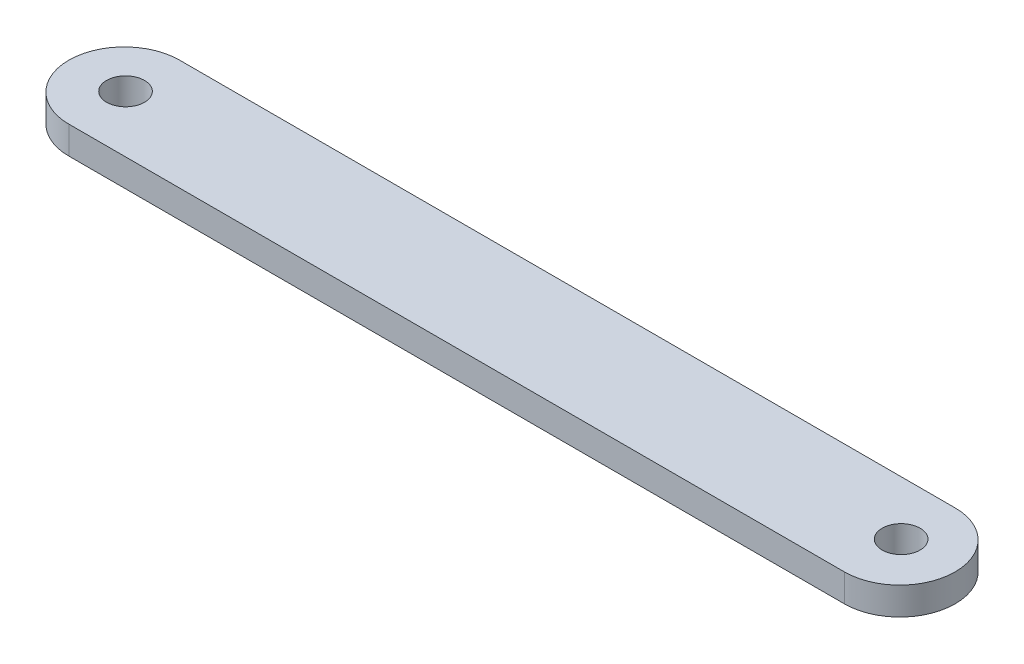
ISO-10303-21;
HEADER;
FILE_DESCRIPTION(('STEP AP214'),'2;1');
FILE_NAME('part.step','',(''),(''),'','','');
FILE_SCHEMA(('AUTOMOTIVE_DESIGN { 1 0 10303 214 1 1 1 1 }'));
ENDSEC;
DATA;
#1=APPLICATION_CONTEXT('core data for automotive mechanical design processes');
#2=APPLICATION_PROTOCOL_DEFINITION('international standard','automotive_design',2000,#1);
#3=PRODUCT_CONTEXT('',#1,'mechanical');
#4=PRODUCT('Part','Part','',(#3));
#5=PRODUCT_RELATED_PRODUCT_CATEGORY('part','',(#4));
#6=PRODUCT_DEFINITION_FORMATION('','',#4);
#7=PRODUCT_DEFINITION_CONTEXT('part definition',#1,'design');
#8=PRODUCT_DEFINITION('design','',#6,#7);
#9=PRODUCT_DEFINITION_SHAPE('','',#8);
#10=(LENGTH_UNIT() NAMED_UNIT(*) SI_UNIT(.MILLI.,.METRE.));
#11=(NAMED_UNIT(*) PLANE_ANGLE_UNIT() SI_UNIT($,.RADIAN.));
#12=(NAMED_UNIT(*) SI_UNIT($,.STERADIAN.) SOLID_ANGLE_UNIT());
#13=UNCERTAINTY_MEASURE_WITH_UNIT(LENGTH_MEASURE(1.E-05),#10,'distance_accuracy_value','');
#14=(GEOMETRIC_REPRESENTATION_CONTEXT(3) GLOBAL_UNCERTAINTY_ASSIGNED_CONTEXT((#13)) GLOBAL_UNIT_ASSIGNED_CONTEXT((#10,
#11,#12)) REPRESENTATION_CONTEXT('',''));
#15=CARTESIAN_POINT('',(0.,0.,0.));
#16=DIRECTION('',(0.,0.,1.));
#17=DIRECTION('',(1.,0.,0.));
#18=AXIS2_PLACEMENT_3D('',#15,#16,#17);
#19=CARTESIAN_POINT('',(-23.1719298245614,3.175,0.724122807017544));
#20=DIRECTION('',(0.,-1.,0.));
#21=DIRECTION('',(0.,0.,-1.));
#22=AXIS2_PLACEMENT_3D('',#19,#20,#21);
#23=CYLINDRICAL_SURFACE('',#22,6.35);
#24=CARTESIAN_POINT('',(-23.1719298245614,0.,0.724122807017544));
#25=DIRECTION('',(0.,1.,0.));
#26=DIRECTION('',(0.,0.,1.));
#27=AXIS2_PLACEMENT_3D('',#24,#25,#26);
#28=CIRCLE('',#27,6.35);
#29=CARTESIAN_POINT('',(-23.1719298245614,0.,-5.62587719298245));
#30=VERTEX_POINT('',#29);
#31=CARTESIAN_POINT('',(-23.1719298245614,0.,7.07412280701754));
#32=VERTEX_POINT('',#31);
#33=EDGE_CURVE('E113',#30,#32,#28,.T.);
#34=ORIENTED_EDGE('',*,*,#33,.T.);
#35=DIRECTION('',(0.,-1.,0.));
#36=VECTOR('',#35,1.);
#37=CARTESIAN_POINT('',(-23.1719298245614,3.175,7.07412280701754));
#38=LINE('',#37,#36);
#39=CARTESIAN_POINT('',(-23.1719298245614,3.175,7.07412280701754));
#40=VERTEX_POINT('',#39);
#41=EDGE_CURVE('E11',#40,#32,#38,.T.);
#42=ORIENTED_EDGE('',*,*,#41,.F.);
#43=CARTESIAN_POINT('',(-23.1719298245614,3.175,0.724122807017544));
#44=DIRECTION('',(0.,1.,0.));
#45=DIRECTION('',(0.,0.,1.));
#46=AXIS2_PLACEMENT_3D('',#43,#44,#45);
#47=CIRCLE('',#46,6.35);
#48=CARTESIAN_POINT('',(-23.1719298245614,3.175,-5.62587719298245));
#49=VERTEX_POINT('',#48);
#50=EDGE_CURVE('E96',#49,#40,#47,.T.);
#51=ORIENTED_EDGE('',*,*,#50,.F.);
#52=DIRECTION('',(0.,-1.,0.));
#53=VECTOR('',#52,1.);
#54=CARTESIAN_POINT('',(-23.1719298245614,3.175,-5.62587719298245));
#55=LINE('',#54,#53);
#56=EDGE_CURVE('E109',#49,#30,#55,.T.);
#57=ORIENTED_EDGE('',*,*,#56,.T.);
#58=EDGE_LOOP('',(#34,#42,#51,#57));
#59=FACE_BOUND('',#58,.T.);
#60=ADVANCED_FACE('F42',(#59),#23,.T.);
#61=CARTESIAN_POINT('',(-23.1719298245614,3.175,7.07412280701754));
#62=DIRECTION('',(0.,0.,-1.));
#63=DIRECTION('',(-1.,0.,0.));
#64=AXIS2_PLACEMENT_3D('',#61,#62,#63);
#65=PLANE('',#64);
#66=DIRECTION('',(1.,0.,0.));
#67=VECTOR('',#66,1.);
#68=CARTESIAN_POINT('',(-23.1719298245614,0.,7.07412280701754));
#69=LINE('',#68,#67);
#70=CARTESIAN_POINT('',(65.7280701754386,0.,7.07412280701754));
#71=VERTEX_POINT('',#70);
#72=EDGE_CURVE('E101',#32,#71,#69,.T.);
#73=ORIENTED_EDGE('',*,*,#72,.T.);
#74=DIRECTION('',(0.,-1.,0.));
#75=VECTOR('',#74,1.);
#76=CARTESIAN_POINT('',(65.7280701754386,3.175,7.07412280701754));
#77=LINE('',#76,#75);
#78=CARTESIAN_POINT('',(65.7280701754386,3.175,7.07412280701754));
#79=VERTEX_POINT('',#78);
#80=EDGE_CURVE('E52',#79,#71,#77,.T.);
#81=ORIENTED_EDGE('',*,*,#80,.F.);
#82=DIRECTION('',(1.,0.,0.));
#83=VECTOR('',#82,1.);
#84=CARTESIAN_POINT('',(-23.1719298245614,3.175,7.07412280701754));
#85=LINE('',#84,#83);
#86=EDGE_CURVE('E91',#40,#79,#85,.T.);
#87=ORIENTED_EDGE('',*,*,#86,.F.);
#88=ORIENTED_EDGE('',*,*,#41,.T.);
#89=EDGE_LOOP('',(#73,#81,#87,#88));
#90=FACE_BOUND('',#89,.T.);
#91=ADVANCED_FACE('F100',(#90),#65,.F.);
#92=CARTESIAN_POINT('',(65.7280701754386,3.175,0.724122807017545));
#93=DIRECTION('',(0.,-1.,0.));
#94=DIRECTION('',(0.,0.,-1.));
#95=AXIS2_PLACEMENT_3D('',#92,#93,#94);
#96=CYLINDRICAL_SURFACE('',#95,6.35);
#97=CARTESIAN_POINT('',(65.7280701754386,0.,0.724122807017545));
#98=DIRECTION('',(0.,1.,0.));
#99=DIRECTION('',(0.,0.,-1.));
#100=AXIS2_PLACEMENT_3D('',#97,#98,#99);
#101=CIRCLE('',#100,6.35);
#102=CARTESIAN_POINT('',(65.7280701754386,0.,-5.62587719298245));
#103=VERTEX_POINT('',#102);
#104=EDGE_CURVE('E78',#71,#103,#101,.T.);
#105=ORIENTED_EDGE('',*,*,#104,.T.);
#106=DIRECTION('',(0.,-1.,0.));
#107=VECTOR('',#106,1.);
#108=CARTESIAN_POINT('',(65.7280701754386,3.175,-5.62587719298245));
#109=LINE('',#108,#107);
#110=CARTESIAN_POINT('',(65.7280701754386,3.175,-5.62587719298245));
#111=VERTEX_POINT('',#110);
#112=EDGE_CURVE('E103',#111,#103,#109,.T.);
#113=ORIENTED_EDGE('',*,*,#112,.F.);
#114=CARTESIAN_POINT('',(65.7280701754386,3.175,0.724122807017545));
#115=DIRECTION('',(0.,1.,0.));
#116=DIRECTION('',(0.,0.,-1.));
#117=AXIS2_PLACEMENT_3D('',#114,#115,#116);
#118=CIRCLE('',#117,6.35);
#119=EDGE_CURVE('E94',#79,#111,#118,.T.);
#120=ORIENTED_EDGE('',*,*,#119,.F.);
#121=ORIENTED_EDGE('',*,*,#80,.T.);
#122=EDGE_LOOP('',(#105,#113,#120,#121));
#123=FACE_BOUND('',#122,.T.);
#124=ADVANCED_FACE('F105',(#123),#96,.T.);
#125=CARTESIAN_POINT('',(-23.1719298245614,3.175,-5.62587719298245));
#126=DIRECTION('',(0.,0.,1.));
#127=DIRECTION('',(1.,0.,0.));
#128=AXIS2_PLACEMENT_3D('',#125,#126,#127);
#129=PLANE('',#128);
#130=DIRECTION('',(-1.,0.,0.));
#131=VECTOR('',#130,1.);
#132=CARTESIAN_POINT('',(-23.1719298245614,0.,-5.62587719298245));
#133=LINE('',#132,#131);
#134=EDGE_CURVE('E84',#103,#30,#133,.T.);
#135=ORIENTED_EDGE('',*,*,#134,.T.);
#136=ORIENTED_EDGE('',*,*,#56,.F.);
#137=DIRECTION('',(-1.,0.,0.));
#138=VECTOR('',#137,1.);
#139=CARTESIAN_POINT('',(-23.1719298245614,3.175,-5.62587719298245));
#140=LINE('',#139,#138);
#141=EDGE_CURVE('E61',#111,#49,#140,.T.);
#142=ORIENTED_EDGE('',*,*,#141,.F.);
#143=ORIENTED_EDGE('',*,*,#112,.T.);
#144=EDGE_LOOP('',(#135,#136,#142,#143));
#145=FACE_BOUND('',#144,.T.);
#146=ADVANCED_FACE('F151',(#145),#129,.F.);
#147=CARTESIAN_POINT('',(-23.1719298245614,3.175,0.724122807017544));
#148=DIRECTION('',(0.,1.,0.));
#149=DIRECTION('',(0.,0.,1.));
#150=AXIS2_PLACEMENT_3D('',#147,#148,#149);
#151=PLANE('',#150);
#152=CARTESIAN_POINT('',(-23.1719298245614,3.175,0.570780948600378));
#153=DIRECTION('',(0.,1.,0.));
#154=DIRECTION('',(0.,0.,1.));
#155=AXIS2_PLACEMENT_3D('',#152,#153,#154);
#156=CIRCLE('',#155,2.175);
#157=CARTESIAN_POINT('',(-23.1719298245614,3.175,2.74578094860038));
#158=VERTEX_POINT('',#157);
#159=EDGE_CURVE('E129',#158,#158,#156,.T.);
#160=ORIENTED_EDGE('',*,*,#159,.F.);
#161=EDGE_LOOP('',(#160));
#162=FACE_BOUND('',#161,.T.);
#163=CARTESIAN_POINT('',(65.7280701754386,3.175,0.570780948600378));
#164=DIRECTION('',(0.,1.,0.));
#165=DIRECTION('',(0.,0.,1.));
#166=AXIS2_PLACEMENT_3D('',#163,#164,#165);
#167=CIRCLE('',#166,2.17500000000001);
#168=CARTESIAN_POINT('',(65.7280701754386,3.175,2.74578094860039));
#169=VERTEX_POINT('',#168);
#170=EDGE_CURVE('E136',#169,#169,#167,.T.);
#171=ORIENTED_EDGE('',*,*,#170,.F.);
#172=EDGE_LOOP('',(#171));
#173=FACE_BOUND('',#172,.T.);
#174=ORIENTED_EDGE('',*,*,#50,.T.);
#175=ORIENTED_EDGE('',*,*,#86,.T.);
#176=ORIENTED_EDGE('',*,*,#119,.T.);
#177=ORIENTED_EDGE('',*,*,#141,.T.);
#178=EDGE_LOOP('',(#174,#175,#176,#177));
#179=FACE_BOUND('',#178,.T.);
#180=ADVANCED_FACE('F92',(#162,#173,#179),#151,.T.);
#181=CARTESIAN_POINT('',(-23.1719298245614,0.,0.724122807017544));
#182=DIRECTION('',(0.,1.,0.));
#183=DIRECTION('',(0.,0.,1.));
#184=AXIS2_PLACEMENT_3D('',#181,#182,#183);
#185=PLANE('',#184);
#186=CARTESIAN_POINT('',(-23.1719298245614,0.,0.570780948600378));
#187=DIRECTION('',(0.,1.,0.));
#188=DIRECTION('',(0.,0.,1.));
#189=AXIS2_PLACEMENT_3D('',#186,#187,#188);
#190=CIRCLE('',#189,2.175);
#191=CARTESIAN_POINT('',(-23.1719298245614,0.,2.74578094860038));
#192=VERTEX_POINT('',#191);
#193=EDGE_CURVE('E45',#192,#192,#190,.T.);
#194=ORIENTED_EDGE('',*,*,#193,.T.);
#195=EDGE_LOOP('',(#194));
#196=FACE_BOUND('',#195,.T.);
#197=CARTESIAN_POINT('',(65.7280701754386,0.,0.570780948600378));
#198=DIRECTION('',(0.,1.,0.));
#199=DIRECTION('',(0.,0.,1.));
#200=AXIS2_PLACEMENT_3D('',#197,#198,#199);
#201=CIRCLE('',#200,2.17500000000001);
#202=CARTESIAN_POINT('',(65.7280701754386,0.,2.74578094860039));
#203=VERTEX_POINT('',#202);
#204=EDGE_CURVE('E126',#203,#203,#201,.T.);
#205=ORIENTED_EDGE('',*,*,#204,.T.);
#206=EDGE_LOOP('',(#205));
#207=FACE_BOUND('',#206,.T.);
#208=ORIENTED_EDGE('',*,*,#33,.F.);
#209=ORIENTED_EDGE('',*,*,#134,.F.);
#210=ORIENTED_EDGE('',*,*,#104,.F.);
#211=ORIENTED_EDGE('',*,*,#72,.F.);
#212=EDGE_LOOP('',(#208,#209,#210,#211));
#213=FACE_BOUND('',#212,.T.);
#214=ADVANCED_FACE('F150',(#196,#207,#213),#185,.F.);
#215=CARTESIAN_POINT('',(65.7280701754386,-9.525,0.570780948600378));
#216=DIRECTION('',(0.,1.,0.));
#217=DIRECTION('',(0.,0.,1.));
#218=AXIS2_PLACEMENT_3D('',#215,#216,#217);
#219=CYLINDRICAL_SURFACE('',#218,2.17500000000001);
#220=ORIENTED_EDGE('',*,*,#170,.T.);
#221=EDGE_LOOP('',(#220));
#222=FACE_BOUND('',#221,.T.);
#223=ORIENTED_EDGE('',*,*,#204,.F.);
#224=EDGE_LOOP('',(#223));
#225=FACE_BOUND('',#224,.T.);
#226=ADVANCED_FACE('F146',(#222,#225),#219,.F.);
#227=CARTESIAN_POINT('',(-23.1719298245614,-9.525,0.570780948600378));
#228=DIRECTION('',(0.,1.,0.));
#229=DIRECTION('',(0.,0.,1.));
#230=AXIS2_PLACEMENT_3D('',#227,#228,#229);
#231=CYLINDRICAL_SURFACE('',#230,2.175);
#232=ORIENTED_EDGE('',*,*,#159,.T.);
#233=EDGE_LOOP('',(#232));
#234=FACE_BOUND('',#233,.T.);
#235=ORIENTED_EDGE('',*,*,#193,.F.);
#236=EDGE_LOOP('',(#235));
#237=FACE_BOUND('',#236,.T.);
#238=ADVANCED_FACE('F201',(#234,#237),#231,.F.);
#239=CLOSED_SHELL('',(#60,#91,#124,#146,#180,#214,#226,#238));
#240=MANIFOLD_SOLID_BREP('B2',#239);
#241=ADVANCED_BREP_SHAPE_REPRESENTATION('',(#18,#240),#14);
#242=SHAPE_DEFINITION_REPRESENTATION(#9,#241);
ENDSEC;
END-ISO-10303-21;
